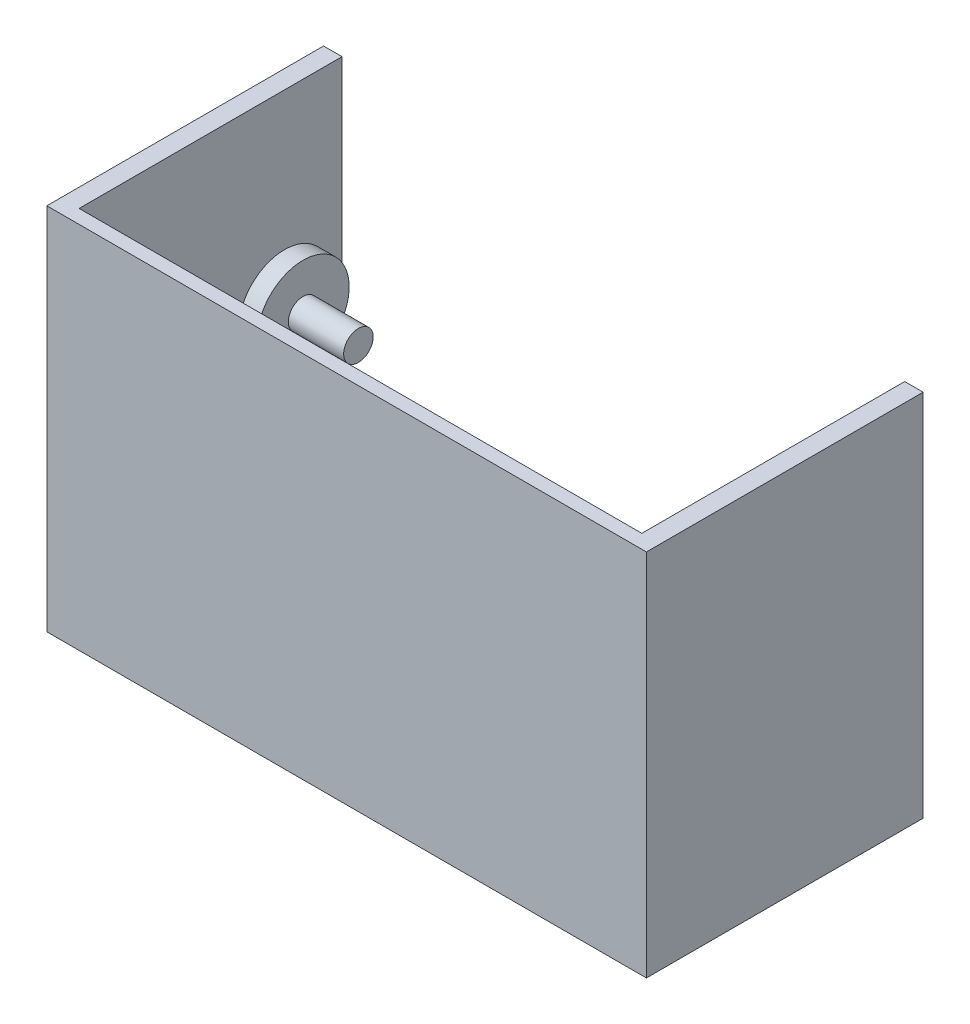
ISO-10303-21;
HEADER;
FILE_DESCRIPTION(('STEP AP214'),'2;1');
FILE_NAME('part.step','',(''),(''),'','','');
FILE_SCHEMA(('AUTOMOTIVE_DESIGN { 1 0 10303 214 1 1 1 1 }'));
ENDSEC;
DATA;
#1=APPLICATION_CONTEXT('core data for automotive mechanical design processes');
#2=APPLICATION_PROTOCOL_DEFINITION('international standard','automotive_design',2000,#1);
#3=PRODUCT_CONTEXT('',#1,'mechanical');
#4=PRODUCT('Part','Part','',(#3));
#5=PRODUCT_RELATED_PRODUCT_CATEGORY('part','',(#4));
#6=PRODUCT_DEFINITION_FORMATION('','',#4);
#7=PRODUCT_DEFINITION_CONTEXT('part definition',#1,'design');
#8=PRODUCT_DEFINITION('design','',#6,#7);
#9=PRODUCT_DEFINITION_SHAPE('','',#8);
#10=(LENGTH_UNIT() NAMED_UNIT(*) SI_UNIT(.MILLI.,.METRE.));
#11=(NAMED_UNIT(*) PLANE_ANGLE_UNIT() SI_UNIT($,.RADIAN.));
#12=(NAMED_UNIT(*) SI_UNIT($,.STERADIAN.) SOLID_ANGLE_UNIT());
#13=UNCERTAINTY_MEASURE_WITH_UNIT(LENGTH_MEASURE(1.E-05),#10,'distance_accuracy_value','');
#14=(GEOMETRIC_REPRESENTATION_CONTEXT(3) GLOBAL_UNCERTAINTY_ASSIGNED_CONTEXT((#13)) GLOBAL_UNIT_ASSIGNED_CONTEXT((#10,
#11,#12)) REPRESENTATION_CONTEXT('',''));
#15=CARTESIAN_POINT('',(0.,0.,0.));
#16=DIRECTION('',(0.,0.,1.));
#17=DIRECTION('',(1.,0.,0.));
#18=AXIS2_PLACEMENT_3D('',#15,#16,#17);
#19=CARTESIAN_POINT('',(0.,0.,0.));
#20=DIRECTION('',(0.,0.,-1.));
#21=DIRECTION('',(-1.,0.,0.));
#22=AXIS2_PLACEMENT_3D('',#19,#20,#21);
#23=PLANE('',#22);
#24=DIRECTION('',(0.,1.,0.));
#25=VECTOR('',#24,1.);
#26=CARTESIAN_POINT('',(-30.5,18.5,0.));
#27=LINE('',#26,#25);
#28=CARTESIAN_POINT('',(-30.5,-20.,0.));
#29=VERTEX_POINT('',#28);
#30=CARTESIAN_POINT('',(-30.5,20.,0.));
#31=VERTEX_POINT('',#30);
#32=EDGE_CURVE('E118',#29,#31,#27,.T.);
#33=ORIENTED_EDGE('',*,*,#32,.F.);
#34=DIRECTION('',(1.,0.,0.));
#35=VECTOR('',#34,1.);
#36=CARTESIAN_POINT('',(32.5,-20.,0.));
#37=LINE('',#36,#35);
#38=CARTESIAN_POINT('',(-32.5,-20.,0.));
#39=VERTEX_POINT('',#38);
#40=EDGE_CURVE('E207',#39,#29,#37,.T.);
#41=ORIENTED_EDGE('',*,*,#40,.F.);
#42=DIRECTION('',(0.,-1.,0.));
#43=VECTOR('',#42,1.);
#44=CARTESIAN_POINT('',(-32.5,20.,0.));
#45=LINE('',#44,#43);
#46=CARTESIAN_POINT('',(-32.5,20.,0.));
#47=VERTEX_POINT('',#46);
#48=EDGE_CURVE('E196',#47,#39,#45,.T.);
#49=ORIENTED_EDGE('',*,*,#48,.F.);
#50=DIRECTION('',(-1.,0.,0.));
#51=VECTOR('',#50,1.);
#52=CARTESIAN_POINT('',(32.5,20.,0.));
#53=LINE('',#52,#51);
#54=EDGE_CURVE('E137',#31,#47,#53,.T.);
#55=ORIENTED_EDGE('',*,*,#54,.F.);
#56=EDGE_LOOP('',(#33,#41,#49,#55));
#57=FACE_BOUND('',#56,.T.);
#58=ADVANCED_FACE('F39',(#57),#23,.T.);
#59=CARTESIAN_POINT('',(-32.5,20.,30.));
#60=DIRECTION('',(1.,0.,0.));
#61=DIRECTION('',(0.,0.,-1.));
#62=AXIS2_PLACEMENT_3D('',#59,#60,#61);
#63=PLANE('',#62);
#64=ORIENTED_EDGE('',*,*,#48,.T.);
#65=DIRECTION('',(0.,0.,-1.));
#66=VECTOR('',#65,1.);
#67=CARTESIAN_POINT('',(-32.5,-20.,30.));
#68=LINE('',#67,#66);
#69=CARTESIAN_POINT('',(-32.5,-20.,30.));
#70=VERTEX_POINT('',#69);
#71=EDGE_CURVE('E49',#70,#39,#68,.T.);
#72=ORIENTED_EDGE('',*,*,#71,.F.);
#73=DIRECTION('',(0.,-1.,0.));
#74=VECTOR('',#73,1.);
#75=CARTESIAN_POINT('',(-32.5,20.,30.));
#76=LINE('',#75,#74);
#77=CARTESIAN_POINT('',(-32.5,20.,30.));
#78=VERTEX_POINT('',#77);
#79=EDGE_CURVE('E136',#78,#70,#76,.T.);
#80=ORIENTED_EDGE('',*,*,#79,.F.);
#81=DIRECTION('',(0.,0.,-1.));
#82=VECTOR('',#81,1.);
#83=CARTESIAN_POINT('',(-32.5,20.,30.));
#84=LINE('',#83,#82);
#85=EDGE_CURVE('E148',#78,#47,#84,.T.);
#86=ORIENTED_EDGE('',*,*,#85,.T.);
#87=EDGE_LOOP('',(#64,#72,#80,#86));
#88=FACE_BOUND('',#87,.T.);
#89=ADVANCED_FACE('F41',(#88),#63,.F.);
#90=CARTESIAN_POINT('',(32.5,-20.,30.));
#91=DIRECTION('',(0.,1.,0.));
#92=DIRECTION('',(-1.,0.,0.));
#93=AXIS2_PLACEMENT_3D('',#90,#91,#92);
#94=PLANE('',#93);
#95=ORIENTED_EDGE('',*,*,#40,.T.);
#96=DIRECTION('',(0.,0.,1.));
#97=VECTOR('',#96,1.);
#98=CARTESIAN_POINT('',(-30.5,-20.,30.));
#99=LINE('',#98,#97);
#100=CARTESIAN_POINT('',(-30.5,-20.,28.5));
#101=VERTEX_POINT('',#100);
#102=EDGE_CURVE('E188',#29,#101,#99,.T.);
#103=ORIENTED_EDGE('',*,*,#102,.T.);
#104=DIRECTION('',(1.,0.,0.));
#105=VECTOR('',#104,1.);
#106=CARTESIAN_POINT('',(32.5,-20.,28.5));
#107=LINE('',#106,#105);
#108=CARTESIAN_POINT('',(30.5,-20.,28.5));
#109=VERTEX_POINT('',#108);
#110=EDGE_CURVE('E119',#101,#109,#107,.T.);
#111=ORIENTED_EDGE('',*,*,#110,.T.);
#112=DIRECTION('',(0.,0.,-1.));
#113=VECTOR('',#112,1.);
#114=CARTESIAN_POINT('',(30.5,-20.,30.));
#115=LINE('',#114,#113);
#116=CARTESIAN_POINT('',(30.5,-20.,0.));
#117=VERTEX_POINT('',#116);
#118=EDGE_CURVE('E183',#109,#117,#115,.T.);
#119=ORIENTED_EDGE('',*,*,#118,.T.);
#120=CARTESIAN_POINT('',(32.5,-20.,0.));
#121=VERTEX_POINT('',#120);
#122=EDGE_CURVE('E114',#117,#121,#37,.T.);
#123=ORIENTED_EDGE('',*,*,#122,.T.);
#124=DIRECTION('',(0.,0.,-1.));
#125=VECTOR('',#124,1.);
#126=CARTESIAN_POINT('',(32.5,-20.,30.));
#127=LINE('',#126,#125);
#128=CARTESIAN_POINT('',(32.5,-20.,30.));
#129=VERTEX_POINT('',#128);
#130=EDGE_CURVE('E155',#129,#121,#127,.T.);
#131=ORIENTED_EDGE('',*,*,#130,.F.);
#132=DIRECTION('',(1.,0.,0.));
#133=VECTOR('',#132,1.);
#134=CARTESIAN_POINT('',(32.5,-20.,30.));
#135=LINE('',#134,#133);
#136=EDGE_CURVE('E142',#70,#129,#135,.T.);
#137=ORIENTED_EDGE('',*,*,#136,.F.);
#138=ORIENTED_EDGE('',*,*,#71,.T.);
#139=EDGE_LOOP('',(#95,#103,#111,#119,#123,#131,#137,#138));
#140=FACE_BOUND('',#139,.T.);
#141=ADVANCED_FACE('F214',(#140),#94,.F.);
#142=CARTESIAN_POINT('',(32.5,20.,30.));
#143=DIRECTION('',(-1.,0.,0.));
#144=DIRECTION('',(0.,-1.,0.));
#145=AXIS2_PLACEMENT_3D('',#142,#143,#144);
#146=PLANE('',#145);
#147=DIRECTION('',(0.,1.,0.));
#148=VECTOR('',#147,1.);
#149=CARTESIAN_POINT('',(32.5,20.,0.));
#150=LINE('',#149,#148);
#151=CARTESIAN_POINT('',(32.5,20.,0.));
#152=VERTEX_POINT('',#151);
#153=EDGE_CURVE('E144',#121,#152,#150,.T.);
#154=ORIENTED_EDGE('',*,*,#153,.T.);
#155=DIRECTION('',(0.,0.,-1.));
#156=VECTOR('',#155,1.);
#157=CARTESIAN_POINT('',(32.5,20.,30.));
#158=LINE('',#157,#156);
#159=CARTESIAN_POINT('',(32.5,20.,30.));
#160=VERTEX_POINT('',#159);
#161=EDGE_CURVE('E134',#160,#152,#158,.T.);
#162=ORIENTED_EDGE('',*,*,#161,.F.);
#163=DIRECTION('',(0.,1.,0.));
#164=VECTOR('',#163,1.);
#165=CARTESIAN_POINT('',(32.5,20.,30.));
#166=LINE('',#165,#164);
#167=EDGE_CURVE('E200',#129,#160,#166,.T.);
#168=ORIENTED_EDGE('',*,*,#167,.F.);
#169=ORIENTED_EDGE('',*,*,#130,.T.);
#170=EDGE_LOOP('',(#154,#162,#168,#169));
#171=FACE_BOUND('',#170,.T.);
#172=ADVANCED_FACE('F217',(#171),#146,.F.);
#173=CARTESIAN_POINT('',(32.5,20.,30.));
#174=DIRECTION('',(0.,-1.,0.));
#175=DIRECTION('',(1.,0.,0.));
#176=AXIS2_PLACEMENT_3D('',#173,#174,#175);
#177=PLANE('',#176);
#178=DIRECTION('',(0.,0.,1.));
#179=VECTOR('',#178,1.);
#180=CARTESIAN_POINT('',(-30.5,20.,1.50000000000001));
#181=LINE('',#180,#179);
#182=CARTESIAN_POINT('',(-30.5,20.,28.5));
#183=VERTEX_POINT('',#182);
#184=EDGE_CURVE('E65',#31,#183,#181,.T.);
#185=ORIENTED_EDGE('',*,*,#184,.F.);
#186=ORIENTED_EDGE('',*,*,#54,.T.);
#187=ORIENTED_EDGE('',*,*,#85,.F.);
#188=DIRECTION('',(-1.,0.,0.));
#189=VECTOR('',#188,1.);
#190=CARTESIAN_POINT('',(32.5,20.,30.));
#191=LINE('',#190,#189);
#192=EDGE_CURVE('E152',#160,#78,#191,.T.);
#193=ORIENTED_EDGE('',*,*,#192,.F.);
#194=ORIENTED_EDGE('',*,*,#161,.T.);
#195=CARTESIAN_POINT('',(30.5,20.,0.));
#196=VERTEX_POINT('',#195);
#197=EDGE_CURVE('E113',#152,#196,#53,.T.);
#198=ORIENTED_EDGE('',*,*,#197,.T.);
#199=DIRECTION('',(0.,0.,-1.));
#200=VECTOR('',#199,1.);
#201=CARTESIAN_POINT('',(30.5,20.,1.5));
#202=LINE('',#201,#200);
#203=CARTESIAN_POINT('',(30.5,20.,28.5));
#204=VERTEX_POINT('',#203);
#205=EDGE_CURVE('E122',#204,#196,#202,.T.);
#206=ORIENTED_EDGE('',*,*,#205,.F.);
#207=DIRECTION('',(1.,0.,0.));
#208=VECTOR('',#207,1.);
#209=CARTESIAN_POINT('',(30.5,20.,28.5));
#210=LINE('',#209,#208);
#211=EDGE_CURVE('E128',#183,#204,#210,.T.);
#212=ORIENTED_EDGE('',*,*,#211,.F.);
#213=EDGE_LOOP('',(#185,#186,#187,#193,#194,#198,#206,#212));
#214=FACE_BOUND('',#213,.T.);
#215=ADVANCED_FACE('F131',(#214),#177,.F.);
#216=CARTESIAN_POINT('',(0.,0.,30.));
#217=DIRECTION('',(0.,0.,-1.));
#218=DIRECTION('',(-1.,0.,0.));
#219=AXIS2_PLACEMENT_3D('',#216,#217,#218);
#220=PLANE('',#219);
#221=ORIENTED_EDGE('',*,*,#79,.T.);
#222=ORIENTED_EDGE('',*,*,#136,.T.);
#223=ORIENTED_EDGE('',*,*,#167,.T.);
#224=ORIENTED_EDGE('',*,*,#192,.T.);
#225=EDGE_LOOP('',(#221,#222,#223,#224));
#226=FACE_BOUND('',#225,.T.);
#227=ADVANCED_FACE('F219',(#226),#220,.F.);
#228=DIRECTION('',(0.,-1.,0.));
#229=VECTOR('',#228,1.);
#230=CARTESIAN_POINT('',(30.5,18.5,0.));
#231=LINE('',#230,#229);
#232=EDGE_CURVE('E108',#196,#117,#231,.T.);
#233=ORIENTED_EDGE('',*,*,#232,.F.);
#234=ORIENTED_EDGE('',*,*,#197,.F.);
#235=ORIENTED_EDGE('',*,*,#153,.F.);
#236=ORIENTED_EDGE('',*,*,#122,.F.);
#237=EDGE_LOOP('',(#233,#234,#235,#236));
#238=FACE_BOUND('',#237,.T.);
#239=ADVANCED_FACE('F110',(#238),#23,.T.);
#240=CARTESIAN_POINT('',(30.5,18.5,20.));
#241=DIRECTION('',(1.,0.,0.));
#242=DIRECTION('',(0.,0.,-1.));
#243=AXIS2_PLACEMENT_3D('',#240,#241,#242);
#244=PLANE('',#243);
#245=CARTESIAN_POINT('',(30.5,0.,6.22489086914607));
#246=DIRECTION('',(1.,0.,0.));
#247=DIRECTION('',(0.,0.,-1.));
#248=AXIS2_PLACEMENT_3D('',#245,#246,#247);
#249=CIRCLE('',#248,3.5);
#250=CARTESIAN_POINT('',(30.5,0.,2.72489086914607));
#251=VERTEX_POINT('',#250);
#252=EDGE_CURVE('E43',#251,#251,#249,.T.);
#253=ORIENTED_EDGE('',*,*,#252,.T.);
#254=EDGE_LOOP('',(#253));
#255=FACE_BOUND('',#254,.T.);
#256=ORIENTED_EDGE('',*,*,#205,.T.);
#257=ORIENTED_EDGE('',*,*,#232,.T.);
#258=ORIENTED_EDGE('',*,*,#118,.F.);
#259=DIRECTION('',(0.,1.,0.));
#260=VECTOR('',#259,1.);
#261=CARTESIAN_POINT('',(30.5,-29.,28.5));
#262=LINE('',#261,#260);
#263=EDGE_CURVE('E57',#109,#204,#262,.T.);
#264=ORIENTED_EDGE('',*,*,#263,.T.);
#265=EDGE_LOOP('',(#256,#257,#258,#264));
#266=FACE_BOUND('',#265,.T.);
#267=ADVANCED_FACE('F123',(#255,#266),#244,.F.);
#268=CARTESIAN_POINT('',(-30.5,18.5,20.));
#269=DIRECTION('',(-1.,0.,0.));
#270=DIRECTION('',(0.,0.,1.));
#271=AXIS2_PLACEMENT_3D('',#268,#269,#270);
#272=PLANE('',#271);
#273=CARTESIAN_POINT('',(-30.5,0.,6.22489086914607));
#274=DIRECTION('',(-1.,0.,0.));
#275=DIRECTION('',(0.,0.,1.));
#276=AXIS2_PLACEMENT_3D('',#273,#274,#275);
#277=CIRCLE('',#276,5.);
#278=CARTESIAN_POINT('',(-30.5,0.,11.2248908691461));
#279=VERTEX_POINT('',#278);
#280=EDGE_CURVE('E161',#279,#279,#277,.T.);
#281=ORIENTED_EDGE('',*,*,#280,.T.);
#282=EDGE_LOOP('',(#281));
#283=FACE_BOUND('',#282,.T.);
#284=ORIENTED_EDGE('',*,*,#32,.T.);
#285=ORIENTED_EDGE('',*,*,#184,.T.);
#286=DIRECTION('',(0.,1.,0.));
#287=VECTOR('',#286,1.);
#288=CARTESIAN_POINT('',(-30.5,-29.,28.5));
#289=LINE('',#288,#287);
#290=EDGE_CURVE('E127',#101,#183,#289,.T.);
#291=ORIENTED_EDGE('',*,*,#290,.F.);
#292=ORIENTED_EDGE('',*,*,#102,.F.);
#293=EDGE_LOOP('',(#284,#285,#291,#292));
#294=FACE_BOUND('',#293,.T.);
#295=ADVANCED_FACE('F228',(#283,#294),#272,.F.);
#296=CARTESIAN_POINT('',(30.5,-29.,28.5));
#297=DIRECTION('',(0.,0.,1.));
#298=DIRECTION('',(1.,0.,0.));
#299=AXIS2_PLACEMENT_3D('',#296,#297,#298);
#300=PLANE('',#299);
#301=ORIENTED_EDGE('',*,*,#290,.T.);
#302=ORIENTED_EDGE('',*,*,#211,.T.);
#303=ORIENTED_EDGE('',*,*,#263,.F.);
#304=ORIENTED_EDGE('',*,*,#110,.F.);
#305=EDGE_LOOP('',(#301,#302,#303,#304));
#306=FACE_BOUND('',#305,.T.);
#307=ADVANCED_FACE('F229',(#306),#300,.F.);
#308=CARTESIAN_POINT('',(-28.5,0.,6.22489086914607));
#309=DIRECTION('',(-1.,0.,0.));
#310=DIRECTION('',(0.,0.,1.));
#311=AXIS2_PLACEMENT_3D('',#308,#309,#310);
#312=CYLINDRICAL_SURFACE('',#311,5.);
#313=CARTESIAN_POINT('',(-28.5,0.,6.22489086914607));
#314=DIRECTION('',(-1.,0.,0.));
#315=DIRECTION('',(0.,0.,1.));
#316=AXIS2_PLACEMENT_3D('',#313,#314,#315);
#317=CIRCLE('',#316,5.);
#318=CARTESIAN_POINT('',(-28.5,0.,11.2248908691461));
#319=VERTEX_POINT('',#318);
#320=EDGE_CURVE('E164',#319,#319,#317,.T.);
#321=ORIENTED_EDGE('',*,*,#320,.T.);
#322=EDGE_LOOP('',(#321));
#323=FACE_BOUND('',#322,.T.);
#324=ORIENTED_EDGE('',*,*,#280,.F.);
#325=EDGE_LOOP('',(#324));
#326=FACE_BOUND('',#325,.T.);
#327=ADVANCED_FACE('F231',(#323,#326),#312,.T.);
#328=CARTESIAN_POINT('',(-28.5,0.,6.22489086914607));
#329=DIRECTION('',(-1.,0.,0.));
#330=DIRECTION('',(0.,0.,1.));
#331=AXIS2_PLACEMENT_3D('',#328,#329,#330);
#332=PLANE('',#331);
#333=CARTESIAN_POINT('',(-28.5,0.,6.22489086914607));
#334=DIRECTION('',(1.,0.,0.));
#335=DIRECTION('',(0.,0.,-1.));
#336=AXIS2_PLACEMENT_3D('',#333,#334,#335);
#337=CIRCLE('',#336,1.6);
#338=CARTESIAN_POINT('',(-28.5,0.,4.62489086914607));
#339=VERTEX_POINT('',#338);
#340=EDGE_CURVE('E11',#339,#339,#337,.T.);
#341=ORIENTED_EDGE('',*,*,#340,.F.);
#342=EDGE_LOOP('',(#341));
#343=FACE_BOUND('',#342,.T.);
#344=ORIENTED_EDGE('',*,*,#320,.F.);
#345=EDGE_LOOP('',(#344));
#346=FACE_BOUND('',#345,.T.);
#347=ADVANCED_FACE('F237',(#343,#346),#332,.F.);
#348=CARTESIAN_POINT('',(-22.5,0.,6.22489086914607));
#349=DIRECTION('',(-1.,0.,0.));
#350=DIRECTION('',(0.,0.,1.));
#351=AXIS2_PLACEMENT_3D('',#348,#349,#350);
#352=CYLINDRICAL_SURFACE('',#351,1.6);
#353=CARTESIAN_POINT('',(-22.5,0.,6.22489086914607));
#354=DIRECTION('',(1.,0.,0.));
#355=DIRECTION('',(0.,0.,-1.));
#356=AXIS2_PLACEMENT_3D('',#353,#354,#355);
#357=CIRCLE('',#356,1.6);
#358=CARTESIAN_POINT('',(-22.5,0.,4.62489086914607));
#359=VERTEX_POINT('',#358);
#360=EDGE_CURVE('E171',#359,#359,#357,.T.);
#361=ORIENTED_EDGE('',*,*,#360,.F.);
#362=EDGE_LOOP('',(#361));
#363=FACE_BOUND('',#362,.T.);
#364=ORIENTED_EDGE('',*,*,#340,.T.);
#365=EDGE_LOOP('',(#364));
#366=FACE_BOUND('',#365,.T.);
#367=ADVANCED_FACE('F333',(#363,#366),#352,.T.);
#368=CARTESIAN_POINT('',(-22.5,0.,6.22489086914607));
#369=DIRECTION('',(1.,0.,0.));
#370=DIRECTION('',(0.,0.,-1.));
#371=AXIS2_PLACEMENT_3D('',#368,#369,#370);
#372=PLANE('',#371);
#373=ORIENTED_EDGE('',*,*,#360,.T.);
#374=EDGE_LOOP('',(#373));
#375=FACE_BOUND('',#374,.T.);
#376=ADVANCED_FACE('F277',(#375),#372,.T.);
#377=CARTESIAN_POINT('',(26.5,0.,6.22489086914607));
#378=DIRECTION('',(1.,0.,0.));
#379=DIRECTION('',(0.,1.,0.));
#380=AXIS2_PLACEMENT_3D('',#377,#378,#379);
#381=CYLINDRICAL_SURFACE('',#380,3.5);
#382=CARTESIAN_POINT('',(26.5,0.,6.22489086914607));
#383=DIRECTION('',(1.,0.,0.));
#384=DIRECTION('',(0.,1.,0.));
#385=AXIS2_PLACEMENT_3D('',#382,#383,#384);
#386=CIRCLE('',#385,3.5);
#387=CARTESIAN_POINT('',(26.5,3.5,6.22489086914607));
#388=VERTEX_POINT('',#387);
#389=EDGE_CURVE('E407',#388,#388,#386,.T.);
#390=ORIENTED_EDGE('',*,*,#389,.T.);
#391=EDGE_LOOP('',(#390));
#392=FACE_BOUND('',#391,.T.);
#393=ORIENTED_EDGE('',*,*,#252,.F.);
#394=EDGE_LOOP('',(#393));
#395=FACE_BOUND('',#394,.T.);
#396=ADVANCED_FACE('F291',(#392,#395),#381,.T.);
#397=CARTESIAN_POINT('',(26.5,0.,6.22489086914607));
#398=DIRECTION('',(1.,0.,0.));
#399=DIRECTION('',(0.,1.,0.));
#400=AXIS2_PLACEMENT_3D('',#397,#398,#399);
#401=PLANE('',#400);
#402=CARTESIAN_POINT('',(26.5,0.,6.22489086914607));
#403=DIRECTION('',(-1.,0.,0.));
#404=DIRECTION('',(0.,-1.,0.));
#405=AXIS2_PLACEMENT_3D('',#402,#403,#404);
#406=CIRCLE('',#405,2.75);
#407=CARTESIAN_POINT('',(26.5,-2.75,6.22489086914607));
#408=VERTEX_POINT('',#407);
#409=EDGE_CURVE('E408',#408,#408,#406,.T.);
#410=ORIENTED_EDGE('',*,*,#409,.F.);
#411=EDGE_LOOP('',(#410));
#412=FACE_BOUND('',#411,.T.);
#413=ORIENTED_EDGE('',*,*,#389,.F.);
#414=EDGE_LOOP('',(#413));
#415=FACE_BOUND('',#414,.T.);
#416=ADVANCED_FACE('F296',(#412,#415),#401,.F.);
#417=CARTESIAN_POINT('',(30.5,0.,6.22489086914607));
#418=DIRECTION('',(-1.,0.,0.));
#419=DIRECTION('',(0.,-1.,0.));
#420=AXIS2_PLACEMENT_3D('',#417,#418,#419);
#421=CYLINDRICAL_SURFACE('',#420,2.75);
#422=CARTESIAN_POINT('',(30.5,0.,6.22489086914607));
#423=DIRECTION('',(-1.,0.,0.));
#424=DIRECTION('',(0.,-1.,0.));
#425=AXIS2_PLACEMENT_3D('',#422,#423,#424);
#426=CIRCLE('',#425,2.75);
#427=CARTESIAN_POINT('',(30.5,-2.75,6.22489086914607));
#428=VERTEX_POINT('',#427);
#429=EDGE_CURVE('E405',#428,#428,#426,.T.);
#430=ORIENTED_EDGE('',*,*,#429,.F.);
#431=EDGE_LOOP('',(#430));
#432=FACE_BOUND('',#431,.T.);
#433=ORIENTED_EDGE('',*,*,#409,.T.);
#434=EDGE_LOOP('',(#433));
#435=FACE_BOUND('',#434,.T.);
#436=ADVANCED_FACE('F306',(#432,#435),#421,.F.);
#437=CARTESIAN_POINT('',(30.5,0.,6.22489086914607));
#438=DIRECTION('',(-1.,0.,0.));
#439=DIRECTION('',(0.,-1.,0.));
#440=AXIS2_PLACEMENT_3D('',#437,#438,#439);
#441=PLANE('',#440);
#442=ORIENTED_EDGE('',*,*,#429,.T.);
#443=EDGE_LOOP('',(#442));
#444=FACE_BOUND('',#443,.T.);
#445=ADVANCED_FACE('F316',(#444),#441,.T.);
#446=CLOSED_SHELL('',(#58,#89,#141,#172,#215,#227,#239,#267,#295,#307,#327,#347,#367,#376,#396,
#416,#436,#445));
#447=MANIFOLD_SOLID_BREP('B2',#446);
#448=ADVANCED_BREP_SHAPE_REPRESENTATION('',(#18,#447),#14);
#449=SHAPE_DEFINITION_REPRESENTATION(#9,#448);
ENDSEC;
END-ISO-10303-21;
